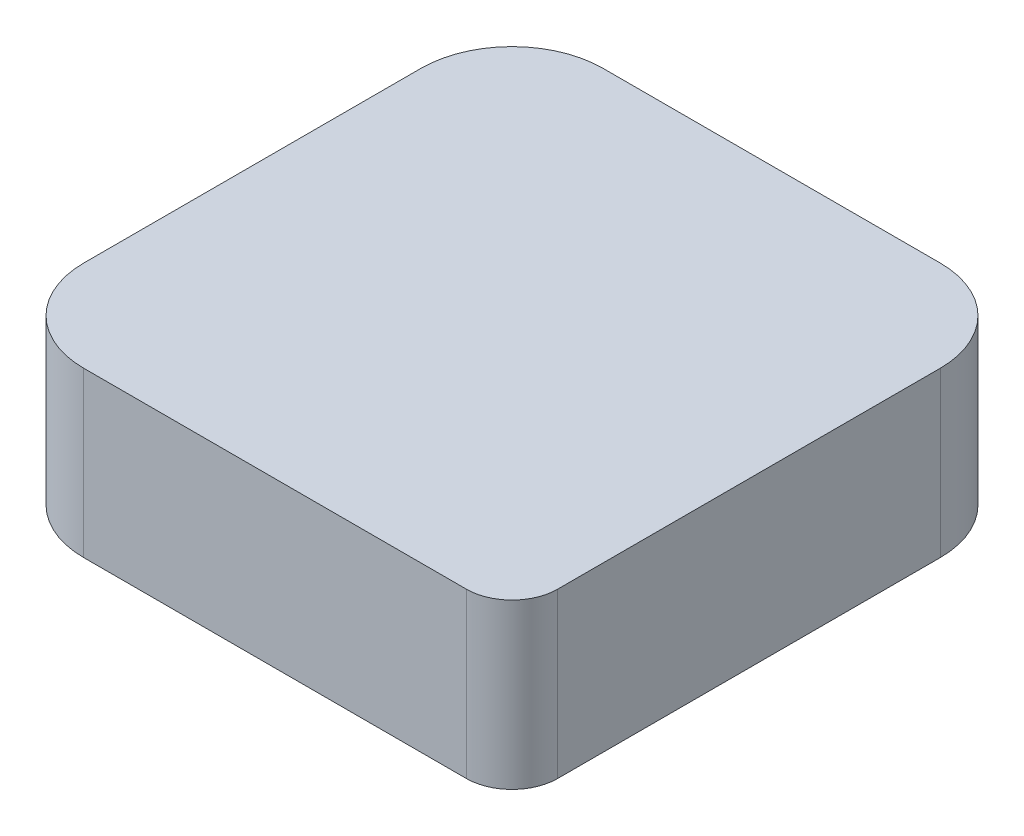
ISO-10303-21;
HEADER;
FILE_DESCRIPTION(('STEP AP214'),'2;1');
FILE_NAME('part.step','',(''),(''),'','','');
FILE_SCHEMA(('AUTOMOTIVE_DESIGN { 1 0 10303 214 1 1 1 1 }'));
ENDSEC;
DATA;
#1=APPLICATION_CONTEXT('core data for automotive mechanical design processes');
#2=APPLICATION_PROTOCOL_DEFINITION('international standard','automotive_design',2000,#1);
#3=PRODUCT_CONTEXT('',#1,'mechanical');
#4=PRODUCT('Part','Part','',(#3));
#5=PRODUCT_RELATED_PRODUCT_CATEGORY('part','',(#4));
#6=PRODUCT_DEFINITION_FORMATION('','',#4);
#7=PRODUCT_DEFINITION_CONTEXT('part definition',#1,'design');
#8=PRODUCT_DEFINITION('design','',#6,#7);
#9=PRODUCT_DEFINITION_SHAPE('','',#8);
#10=(LENGTH_UNIT() NAMED_UNIT(*) SI_UNIT(.MILLI.,.METRE.));
#11=(NAMED_UNIT(*) PLANE_ANGLE_UNIT() SI_UNIT($,.RADIAN.));
#12=(NAMED_UNIT(*) SI_UNIT($,.STERADIAN.) SOLID_ANGLE_UNIT());
#13=UNCERTAINTY_MEASURE_WITH_UNIT(LENGTH_MEASURE(1.E-05),#10,'distance_accuracy_value','');
#14=(GEOMETRIC_REPRESENTATION_CONTEXT(3) GLOBAL_UNCERTAINTY_ASSIGNED_CONTEXT((#13)) GLOBAL_UNIT_ASSIGNED_CONTEXT((#10,
#11,#12)) REPRESENTATION_CONTEXT('',''));
#15=CARTESIAN_POINT('',(0.,0.,0.));
#16=DIRECTION('',(0.,0.,1.));
#17=DIRECTION('',(1.,0.,0.));
#18=AXIS2_PLACEMENT_3D('',#15,#16,#17);
#19=CARTESIAN_POINT('',(0.,18.,0.));
#20=DIRECTION('',(1.,0.,0.));
#21=DIRECTION('',(0.,0.,-1.));
#22=AXIS2_PLACEMENT_3D('',#19,#20,#21);
#23=PLANE('',#22);
#24=DIRECTION('',(0.,0.,1.));
#25=VECTOR('',#24,1.);
#26=CARTESIAN_POINT('',(0.,0.,0.));
#27=LINE('',#26,#25);
#28=CARTESIAN_POINT('',(0.,0.,-47.));
#29=VERTEX_POINT('',#28);
#30=CARTESIAN_POINT('',(0.,0.,-10.));
#31=VERTEX_POINT('',#30);
#32=EDGE_CURVE('E139',#29,#31,#27,.T.);
#33=ORIENTED_EDGE('',*,*,#32,.T.);
#34=DIRECTION('',(0.,-1.,0.));
#35=VECTOR('',#34,1.);
#36=CARTESIAN_POINT('',(0.,18.,-10.));
#37=LINE('',#36,#35);
#38=CARTESIAN_POINT('',(0.,18.,-10.));
#39=VERTEX_POINT('',#38);
#40=EDGE_CURVE('E164',#31,#39,#37,.F.);
#41=ORIENTED_EDGE('',*,*,#40,.T.);
#42=DIRECTION('',(0.,0.,1.));
#43=VECTOR('',#42,1.);
#44=CARTESIAN_POINT('',(0.,18.,0.));
#45=LINE('',#44,#43);
#46=CARTESIAN_POINT('',(0.,18.,-47.));
#47=VERTEX_POINT('',#46);
#48=EDGE_CURVE('E137',#47,#39,#45,.T.);
#49=ORIENTED_EDGE('',*,*,#48,.F.);
#50=DIRECTION('',(0.,-1.,0.));
#51=VECTOR('',#50,1.);
#52=CARTESIAN_POINT('',(0.,18.,-47.));
#53=LINE('',#52,#51);
#54=EDGE_CURVE('E160',#47,#29,#53,.T.);
#55=ORIENTED_EDGE('',*,*,#54,.T.);
#56=EDGE_LOOP('',(#33,#41,#49,#55));
#57=FACE_BOUND('',#56,.T.);
#58=ADVANCED_FACE('F39',(#57),#23,.F.);
#59=CARTESIAN_POINT('',(0.,18.,0.));
#60=DIRECTION('',(0.,0.,-1.));
#61=DIRECTION('',(-1.,0.,0.));
#62=AXIS2_PLACEMENT_3D('',#59,#60,#61);
#63=PLANE('',#62);
#64=DIRECTION('',(1.,0.,0.));
#65=VECTOR('',#64,1.);
#66=CARTESIAN_POINT('',(0.,18.,0.));
#67=LINE('',#66,#65);
#68=CARTESIAN_POINT('',(10.,18.,0.));
#69=VERTEX_POINT('',#68);
#70=CARTESIAN_POINT('',(52.,18.,0.));
#71=VERTEX_POINT('',#70);
#72=EDGE_CURVE('E183',#69,#71,#67,.T.);
#73=ORIENTED_EDGE('',*,*,#72,.F.);
#74=DIRECTION('',(0.,-1.,0.));
#75=VECTOR('',#74,1.);
#76=CARTESIAN_POINT('',(10.,18.,0.));
#77=LINE('',#76,#75);
#78=CARTESIAN_POINT('',(10.,0.,0.));
#79=VERTEX_POINT('',#78);
#80=EDGE_CURVE('E148',#69,#79,#77,.T.);
#81=ORIENTED_EDGE('',*,*,#80,.T.);
#82=DIRECTION('',(1.,0.,0.));
#83=VECTOR('',#82,1.);
#84=CARTESIAN_POINT('',(0.,0.,0.));
#85=LINE('',#84,#83);
#86=CARTESIAN_POINT('',(52.,0.,0.));
#87=VERTEX_POINT('',#86);
#88=EDGE_CURVE('E133',#79,#87,#85,.T.);
#89=ORIENTED_EDGE('',*,*,#88,.T.);
#90=DIRECTION('',(0.,-1.,0.));
#91=VECTOR('',#90,1.);
#92=CARTESIAN_POINT('',(52.,18.,0.));
#93=LINE('',#92,#91);
#94=EDGE_CURVE('E112',#87,#71,#93,.F.);
#95=ORIENTED_EDGE('',*,*,#94,.T.);
#96=EDGE_LOOP('',(#73,#81,#89,#95));
#97=FACE_BOUND('',#96,.T.);
#98=ADVANCED_FACE('F203',(#97),#63,.F.);
#99=CARTESIAN_POINT('',(57.,18.,0.));
#100=DIRECTION('',(-1.,0.,0.));
#101=DIRECTION('',(0.,0.,1.));
#102=AXIS2_PLACEMENT_3D('',#99,#100,#101);
#103=PLANE('',#102);
#104=DIRECTION('',(0.,0.,-1.));
#105=VECTOR('',#104,1.);
#106=CARTESIAN_POINT('',(57.,0.,0.));
#107=LINE('',#106,#105);
#108=CARTESIAN_POINT('',(57.,0.,-5.));
#109=VERTEX_POINT('',#108);
#110=CARTESIAN_POINT('',(57.,0.,-47.));
#111=VERTEX_POINT('',#110);
#112=EDGE_CURVE('E122',#109,#111,#107,.T.);
#113=ORIENTED_EDGE('',*,*,#112,.T.);
#114=DIRECTION('',(0.,-1.,0.));
#115=VECTOR('',#114,1.);
#116=CARTESIAN_POINT('',(57.,18.,-47.));
#117=LINE('',#116,#115);
#118=CARTESIAN_POINT('',(57.,18.,-47.));
#119=VERTEX_POINT('',#118);
#120=EDGE_CURVE('E11',#111,#119,#117,.F.);
#121=ORIENTED_EDGE('',*,*,#120,.T.);
#122=DIRECTION('',(0.,0.,-1.));
#123=VECTOR('',#122,1.);
#124=CARTESIAN_POINT('',(57.,18.,0.));
#125=LINE('',#124,#123);
#126=CARTESIAN_POINT('',(57.,18.,-5.));
#127=VERTEX_POINT('',#126);
#128=EDGE_CURVE('E124',#127,#119,#125,.T.);
#129=ORIENTED_EDGE('',*,*,#128,.F.);
#130=DIRECTION('',(0.,-1.,0.));
#131=VECTOR('',#130,1.);
#132=CARTESIAN_POINT('',(57.,18.,-5.));
#133=LINE('',#132,#131);
#134=EDGE_CURVE('E110',#127,#109,#133,.T.);
#135=ORIENTED_EDGE('',*,*,#134,.T.);
#136=EDGE_LOOP('',(#113,#121,#129,#135));
#137=FACE_BOUND('',#136,.T.);
#138=ADVANCED_FACE('F121',(#137),#103,.F.);
#139=CARTESIAN_POINT('',(0.,18.,-57.));
#140=DIRECTION('',(0.,0.,1.));
#141=DIRECTION('',(1.,0.,0.));
#142=AXIS2_PLACEMENT_3D('',#139,#140,#141);
#143=PLANE('',#142);
#144=DIRECTION('',(-1.,0.,0.));
#145=VECTOR('',#144,1.);
#146=CARTESIAN_POINT('',(0.,0.,-57.));
#147=LINE('',#146,#145);
#148=CARTESIAN_POINT('',(47.,0.,-57.));
#149=VERTEX_POINT('',#148);
#150=CARTESIAN_POINT('',(10.,0.,-57.));
#151=VERTEX_POINT('',#150);
#152=EDGE_CURVE('E132',#149,#151,#147,.T.);
#153=ORIENTED_EDGE('',*,*,#152,.T.);
#154=DIRECTION('',(0.,-1.,0.));
#155=VECTOR('',#154,1.);
#156=CARTESIAN_POINT('',(10.,18.,-57.));
#157=LINE('',#156,#155);
#158=CARTESIAN_POINT('',(10.,18.,-57.));
#159=VERTEX_POINT('',#158);
#160=EDGE_CURVE('E48',#151,#159,#157,.F.);
#161=ORIENTED_EDGE('',*,*,#160,.T.);
#162=DIRECTION('',(-1.,0.,0.));
#163=VECTOR('',#162,1.);
#164=CARTESIAN_POINT('',(0.,18.,-57.));
#165=LINE('',#164,#163);
#166=CARTESIAN_POINT('',(47.,18.,-57.));
#167=VERTEX_POINT('',#166);
#168=EDGE_CURVE('E126',#167,#159,#165,.T.);
#169=ORIENTED_EDGE('',*,*,#168,.F.);
#170=DIRECTION('',(0.,-1.,0.));
#171=VECTOR('',#170,1.);
#172=CARTESIAN_POINT('',(47.,18.,-57.));
#173=LINE('',#172,#171);
#174=EDGE_CURVE('E175',#167,#149,#173,.T.);
#175=ORIENTED_EDGE('',*,*,#174,.T.);
#176=EDGE_LOOP('',(#153,#161,#169,#175));
#177=FACE_BOUND('',#176,.T.);
#178=ADVANCED_FACE('F206',(#177),#143,.F.);
#179=CARTESIAN_POINT('',(0.,18.,0.));
#180=DIRECTION('',(0.,-1.,0.));
#181=DIRECTION('',(0.,0.,-1.));
#182=AXIS2_PLACEMENT_3D('',#179,#180,#181);
#183=PLANE('',#182);
#184=ORIENTED_EDGE('',*,*,#48,.T.);
#185=CARTESIAN_POINT('',(10.,18.,-10.));
#186=DIRECTION('',(0.,-1.,0.));
#187=DIRECTION('',(0.,0.,-1.));
#188=AXIS2_PLACEMENT_3D('',#185,#186,#187);
#189=CIRCLE('',#188,10.);
#190=EDGE_CURVE('E172',#39,#69,#189,.F.);
#191=ORIENTED_EDGE('',*,*,#190,.T.);
#192=ORIENTED_EDGE('',*,*,#72,.T.);
#193=CARTESIAN_POINT('',(52.,18.,-5.));
#194=DIRECTION('',(0.,-1.,0.));
#195=DIRECTION('',(0.,0.,-1.));
#196=AXIS2_PLACEMENT_3D('',#193,#194,#195);
#197=CIRCLE('',#196,5.);
#198=EDGE_CURVE('E145',#71,#127,#197,.F.);
#199=ORIENTED_EDGE('',*,*,#198,.T.);
#200=ORIENTED_EDGE('',*,*,#128,.T.);
#201=CARTESIAN_POINT('',(47.,18.,-47.));
#202=DIRECTION('',(0.,-1.,0.));
#203=DIRECTION('',(0.,0.,-1.));
#204=AXIS2_PLACEMENT_3D('',#201,#202,#203);
#205=CIRCLE('',#204,10.);
#206=EDGE_CURVE('E61',#119,#167,#205,.F.);
#207=ORIENTED_EDGE('',*,*,#206,.T.);
#208=ORIENTED_EDGE('',*,*,#168,.T.);
#209=CARTESIAN_POINT('',(10.,18.,-47.));
#210=DIRECTION('',(0.,-1.,0.));
#211=DIRECTION('',(0.,0.,-1.));
#212=AXIS2_PLACEMENT_3D('',#209,#210,#211);
#213=CIRCLE('',#212,10.);
#214=EDGE_CURVE('E169',#159,#47,#213,.F.);
#215=ORIENTED_EDGE('',*,*,#214,.T.);
#216=EDGE_LOOP('',(#184,#191,#192,#199,#200,#207,#208,#215));
#217=FACE_BOUND('',#216,.T.);
#218=ADVANCED_FACE('F201',(#217),#183,.F.);
#219=CARTESIAN_POINT('',(0.,0.,0.));
#220=DIRECTION('',(0.,-1.,0.));
#221=DIRECTION('',(0.,0.,-1.));
#222=AXIS2_PLACEMENT_3D('',#219,#220,#221);
#223=PLANE('',#222);
#224=ORIENTED_EDGE('',*,*,#88,.F.);
#225=CARTESIAN_POINT('',(10.,0.,-10.));
#226=DIRECTION('',(0.,-1.,0.));
#227=DIRECTION('',(0.,0.,-1.));
#228=AXIS2_PLACEMENT_3D('',#225,#226,#227);
#229=CIRCLE('',#228,10.);
#230=EDGE_CURVE('E157',#79,#31,#229,.T.);
#231=ORIENTED_EDGE('',*,*,#230,.T.);
#232=ORIENTED_EDGE('',*,*,#32,.F.);
#233=CARTESIAN_POINT('',(10.,0.,-47.));
#234=DIRECTION('',(0.,-1.,0.));
#235=DIRECTION('',(0.,0.,-1.));
#236=AXIS2_PLACEMENT_3D('',#233,#234,#235);
#237=CIRCLE('',#236,10.);
#238=EDGE_CURVE('E154',#29,#151,#237,.T.);
#239=ORIENTED_EDGE('',*,*,#238,.T.);
#240=ORIENTED_EDGE('',*,*,#152,.F.);
#241=CARTESIAN_POINT('',(47.,0.,-47.));
#242=DIRECTION('',(0.,-1.,0.));
#243=DIRECTION('',(0.,0.,-1.));
#244=AXIS2_PLACEMENT_3D('',#241,#242,#243);
#245=CIRCLE('',#244,10.);
#246=EDGE_CURVE('E130',#149,#111,#245,.T.);
#247=ORIENTED_EDGE('',*,*,#246,.T.);
#248=ORIENTED_EDGE('',*,*,#112,.F.);
#249=CARTESIAN_POINT('',(52.,0.,-5.));
#250=DIRECTION('',(0.,-1.,0.));
#251=DIRECTION('',(0.,0.,-1.));
#252=AXIS2_PLACEMENT_3D('',#249,#250,#251);
#253=CIRCLE('',#252,5.);
#254=EDGE_CURVE('E106',#109,#87,#253,.T.);
#255=ORIENTED_EDGE('',*,*,#254,.T.);
#256=EDGE_LOOP('',(#224,#231,#232,#239,#240,#247,#248,#255));
#257=FACE_BOUND('',#256,.T.);
#258=ADVANCED_FACE('F128',(#257),#223,.T.);
#259=CARTESIAN_POINT('',(52.,18.,-5.));
#260=DIRECTION('',(0.,-1.,0.));
#261=DIRECTION('',(0.,0.,-1.));
#262=AXIS2_PLACEMENT_3D('',#259,#260,#261);
#263=CYLINDRICAL_SURFACE('',#262,5.);
#264=ORIENTED_EDGE('',*,*,#198,.F.);
#265=ORIENTED_EDGE('',*,*,#94,.F.);
#266=ORIENTED_EDGE('',*,*,#254,.F.);
#267=ORIENTED_EDGE('',*,*,#134,.F.);
#268=EDGE_LOOP('',(#264,#265,#266,#267));
#269=FACE_BOUND('',#268,.T.);
#270=ADVANCED_FACE('F109',(#269),#263,.T.);
#271=CARTESIAN_POINT('',(10.,18.,-10.));
#272=DIRECTION('',(0.,-1.,0.));
#273=DIRECTION('',(0.,0.,-1.));
#274=AXIS2_PLACEMENT_3D('',#271,#272,#273);
#275=CYLINDRICAL_SURFACE('',#274,10.);
#276=ORIENTED_EDGE('',*,*,#190,.F.);
#277=ORIENTED_EDGE('',*,*,#40,.F.);
#278=ORIENTED_EDGE('',*,*,#230,.F.);
#279=ORIENTED_EDGE('',*,*,#80,.F.);
#280=EDGE_LOOP('',(#276,#277,#278,#279));
#281=FACE_BOUND('',#280,.T.);
#282=ADVANCED_FACE('F198',(#281),#275,.T.);
#283=CARTESIAN_POINT('',(10.,18.,-47.));
#284=DIRECTION('',(0.,-1.,0.));
#285=DIRECTION('',(0.,0.,-1.));
#286=AXIS2_PLACEMENT_3D('',#283,#284,#285);
#287=CYLINDRICAL_SURFACE('',#286,10.);
#288=ORIENTED_EDGE('',*,*,#214,.F.);
#289=ORIENTED_EDGE('',*,*,#160,.F.);
#290=ORIENTED_EDGE('',*,*,#238,.F.);
#291=ORIENTED_EDGE('',*,*,#54,.F.);
#292=EDGE_LOOP('',(#288,#289,#290,#291));
#293=FACE_BOUND('',#292,.T.);
#294=ADVANCED_FACE('F209',(#293),#287,.T.);
#295=CARTESIAN_POINT('',(47.,18.,-47.));
#296=DIRECTION('',(0.,-1.,0.));
#297=DIRECTION('',(0.,0.,-1.));
#298=AXIS2_PLACEMENT_3D('',#295,#296,#297);
#299=CYLINDRICAL_SURFACE('',#298,10.);
#300=ORIENTED_EDGE('',*,*,#206,.F.);
#301=ORIENTED_EDGE('',*,*,#120,.F.);
#302=ORIENTED_EDGE('',*,*,#246,.F.);
#303=ORIENTED_EDGE('',*,*,#174,.F.);
#304=EDGE_LOOP('',(#300,#301,#302,#303));
#305=FACE_BOUND('',#304,.T.);
#306=ADVANCED_FACE('F41',(#305),#299,.T.);
#307=CLOSED_SHELL('',(#58,#98,#138,#178,#218,#258,#270,#282,#294,#306));
#308=MANIFOLD_SOLID_BREP('B2',#307);
#309=ADVANCED_BREP_SHAPE_REPRESENTATION('',(#18,#308),#14);
#310=SHAPE_DEFINITION_REPRESENTATION(#9,#309);
ENDSEC;
END-ISO-10303-21;
